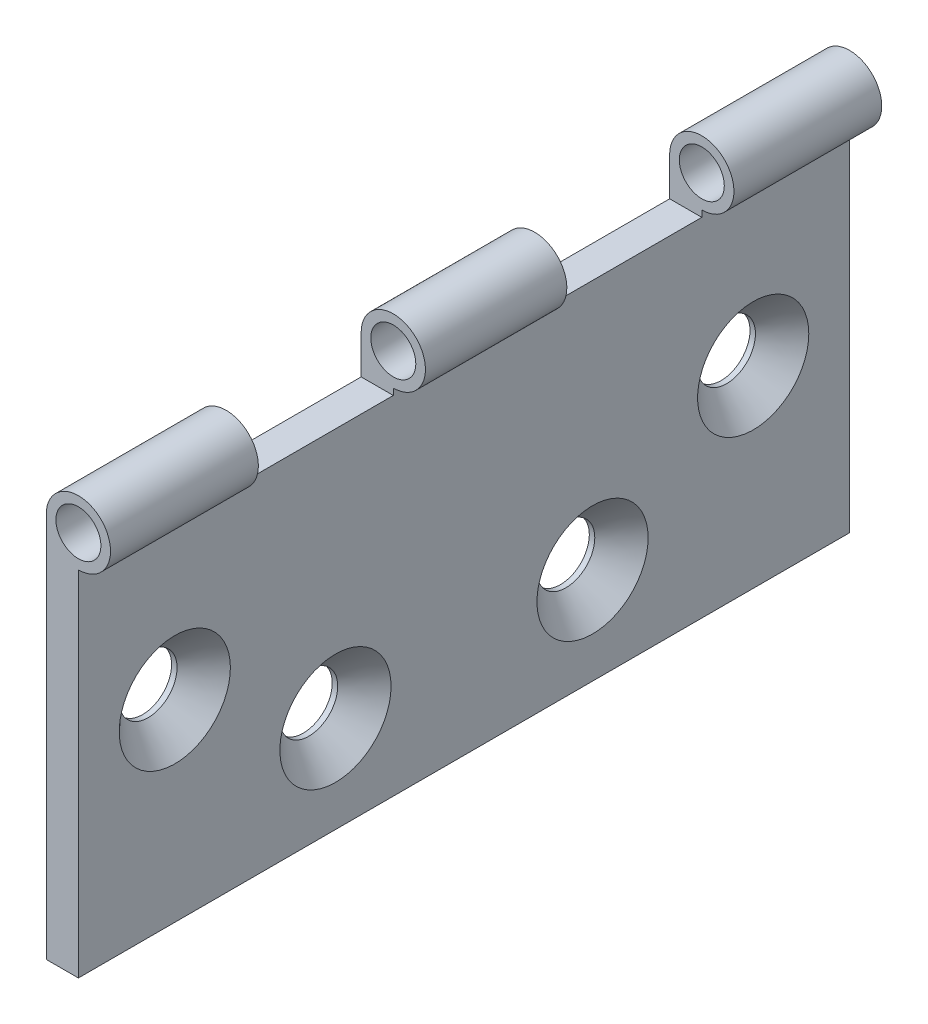
ISO-10303-21;
HEADER;
FILE_DESCRIPTION(('STEP AP214'),'2;1');
FILE_NAME('part.step','',(''),(''),'','','');
FILE_SCHEMA(('AUTOMOTIVE_DESIGN { 1 0 10303 214 1 1 1 1 }'));
ENDSEC;
DATA;
#1=APPLICATION_CONTEXT('core data for automotive mechanical design processes');
#2=APPLICATION_PROTOCOL_DEFINITION('international standard','automotive_design',2000,#1);
#3=PRODUCT_CONTEXT('',#1,'mechanical');
#4=PRODUCT('Part','Part','',(#3));
#5=PRODUCT_RELATED_PRODUCT_CATEGORY('part','',(#4));
#6=PRODUCT_DEFINITION_FORMATION('','',#4);
#7=PRODUCT_DEFINITION_CONTEXT('part definition',#1,'design');
#8=PRODUCT_DEFINITION('design','',#6,#7);
#9=PRODUCT_DEFINITION_SHAPE('','',#8);
#10=(LENGTH_UNIT() NAMED_UNIT(*) SI_UNIT(.MILLI.,.METRE.));
#11=(NAMED_UNIT(*) PLANE_ANGLE_UNIT() SI_UNIT($,.RADIAN.));
#12=(NAMED_UNIT(*) SI_UNIT($,.STERADIAN.) SOLID_ANGLE_UNIT());
#13=UNCERTAINTY_MEASURE_WITH_UNIT(LENGTH_MEASURE(1.E-05),#10,'distance_accuracy_value','');
#14=(GEOMETRIC_REPRESENTATION_CONTEXT(3) GLOBAL_UNCERTAINTY_ASSIGNED_CONTEXT((#13)) GLOBAL_UNIT_ASSIGNED_CONTEXT((#10,
#11,#12)) REPRESENTATION_CONTEXT('',''));
#15=CARTESIAN_POINT('',(0.,0.,0.));
#16=DIRECTION('',(0.,0.,1.));
#17=DIRECTION('',(1.,0.,0.));
#18=AXIS2_PLACEMENT_3D('',#15,#16,#17);
#19=CARTESIAN_POINT('',(5.,60.,60.));
#20=DIRECTION('',(0.,0.,-1.));
#21=DIRECTION('',(-1.,0.,0.));
#22=AXIS2_PLACEMENT_3D('',#19,#20,#21);
#23=CYLINDRICAL_SURFACE('',#22,5.);
#24=DIRECTION('',(0.,0.,-1.));
#25=VECTOR('',#24,1.);
#26=CARTESIAN_POINT('',(5.,55.,60.));
#27=LINE('',#26,#25);
#28=CARTESIAN_POINT('',(5.,55.,60.));
#29=VERTEX_POINT('',#28);
#30=CARTESIAN_POINT('',(5.,55.,37.));
#31=VERTEX_POINT('',#30);
#32=EDGE_CURVE('E95',#29,#31,#27,.T.);
#33=ORIENTED_EDGE('',*,*,#32,.T.);
#34=CARTESIAN_POINT('',(5.,60.,37.));
#35=DIRECTION('',(0.,0.,1.));
#36=DIRECTION('',(1.,0.,0.));
#37=AXIS2_PLACEMENT_3D('',#34,#35,#36);
#38=CIRCLE('',#37,5.);
#39=CARTESIAN_POINT('',(0.,60.,37.));
#40=VERTEX_POINT('',#39);
#41=EDGE_CURVE('E135',#31,#40,#38,.T.);
#42=ORIENTED_EDGE('',*,*,#41,.T.);
#43=DIRECTION('',(0.,0.,-1.));
#44=VECTOR('',#43,1.);
#45=CARTESIAN_POINT('',(0.,60.,60.));
#46=LINE('',#45,#44);
#47=CARTESIAN_POINT('',(0.,60.,60.));
#48=VERTEX_POINT('',#47);
#49=EDGE_CURVE('E11',#48,#40,#46,.T.);
#50=ORIENTED_EDGE('',*,*,#49,.F.);
#51=CARTESIAN_POINT('',(5.,60.,60.));
#52=DIRECTION('',(0.,0.,1.));
#53=DIRECTION('',(1.,0.,0.));
#54=AXIS2_PLACEMENT_3D('',#51,#52,#53);
#55=CIRCLE('',#54,5.);
#56=CARTESIAN_POINT('',(10.,60.,60.));
#57=VERTEX_POINT('',#56);
#58=EDGE_CURVE('E188',#57,#48,#55,.T.);
#59=ORIENTED_EDGE('',*,*,#58,.F.);
#60=EDGE_CURVE('E185',#29,#57,#55,.T.);
#61=ORIENTED_EDGE('',*,*,#60,.F.);
#62=EDGE_LOOP('',(#33,#42,#50,#59,#61));
#63=FACE_BOUND('',#62,.T.);
#64=ADVANCED_FACE('F39',(#63),#23,.T.);
#65=CARTESIAN_POINT('',(0.,60.,11.));
#66=VERTEX_POINT('',#65);
#67=CARTESIAN_POINT('',(0.,60.,-11.));
#68=VERTEX_POINT('',#67);
#69=EDGE_CURVE('E49',#66,#68,#46,.T.);
#70=ORIENTED_EDGE('',*,*,#69,.F.);
#71=CARTESIAN_POINT('',(5.,60.,11.));
#72=DIRECTION('',(0.,0.,-1.));
#73=DIRECTION('',(0.,1.,0.));
#74=AXIS2_PLACEMENT_3D('',#71,#72,#73);
#75=CIRCLE('',#74,5.);
#76=CARTESIAN_POINT('',(5.,55.,11.));
#77=VERTEX_POINT('',#76);
#78=EDGE_CURVE('E115',#66,#77,#75,.T.);
#79=ORIENTED_EDGE('',*,*,#78,.T.);
#80=CARTESIAN_POINT('',(5.,55.,-11.));
#81=VERTEX_POINT('',#80);
#82=EDGE_CURVE('E196',#77,#81,#27,.T.);
#83=ORIENTED_EDGE('',*,*,#82,.T.);
#84=CARTESIAN_POINT('',(5.,60.,-11.));
#85=DIRECTION('',(0.,0.,1.));
#86=DIRECTION('',(0.,-1.,0.));
#87=AXIS2_PLACEMENT_3D('',#84,#85,#86);
#88=CIRCLE('',#87,5.);
#89=EDGE_CURVE('E111',#81,#68,#88,.T.);
#90=ORIENTED_EDGE('',*,*,#89,.T.);
#91=EDGE_LOOP('',(#70,#79,#83,#90));
#92=FACE_BOUND('',#91,.T.);
#93=ADVANCED_FACE('F312',(#92),#23,.T.);
#94=CARTESIAN_POINT('',(5.,60.,-60.));
#95=DIRECTION('',(0.,0.,1.));
#96=DIRECTION('',(1.,0.,0.));
#97=AXIS2_PLACEMENT_3D('',#94,#95,#96);
#98=CYLINDRICAL_SURFACE('',#97,3.5);
#99=CARTESIAN_POINT('',(5.,60.,37.));
#100=DIRECTION('',(0.,0.,1.));
#101=DIRECTION('',(1.,0.,0.));
#102=AXIS2_PLACEMENT_3D('',#99,#100,#101);
#103=CIRCLE('',#102,3.5);
#104=CARTESIAN_POINT('',(8.5,60.,37.));
#105=VERTEX_POINT('',#104);
#106=EDGE_CURVE('E43',#105,#105,#103,.F.);
#107=ORIENTED_EDGE('',*,*,#106,.T.);
#108=EDGE_LOOP('',(#107));
#109=FACE_BOUND('',#108,.T.);
#110=CARTESIAN_POINT('',(5.,60.,60.));
#111=DIRECTION('',(0.,0.,1.));
#112=DIRECTION('',(1.,0.,0.));
#113=AXIS2_PLACEMENT_3D('',#110,#111,#112);
#114=CIRCLE('',#113,3.5);
#115=CARTESIAN_POINT('',(8.5,60.,60.));
#116=VERTEX_POINT('',#115);
#117=EDGE_CURVE('E181',#116,#116,#114,.T.);
#118=ORIENTED_EDGE('',*,*,#117,.T.);
#119=EDGE_LOOP('',(#118));
#120=FACE_BOUND('',#119,.T.);
#121=ADVANCED_FACE('F336',(#109,#120),#98,.F.);
#122=CARTESIAN_POINT('',(5.,0.,60.));
#123=DIRECTION('',(-1.,0.,0.));
#124=DIRECTION('',(0.,0.,1.));
#125=AXIS2_PLACEMENT_3D('',#122,#123,#124);
#126=PLANE('',#125);
#127=CARTESIAN_POINT('',(5.,30.,-45.));
#128=DIRECTION('',(1.,0.,0.));
#129=DIRECTION('',(0.,0.,-1.));
#130=AXIS2_PLACEMENT_3D('',#127,#128,#129);
#131=CIRCLE('',#130,8.65);
#132=CARTESIAN_POINT('',(5.,30.,-53.65));
#133=VERTEX_POINT('',#132);
#134=EDGE_CURVE('E145',#133,#133,#131,.T.);
#135=ORIENTED_EDGE('',*,*,#134,.F.);
#136=EDGE_LOOP('',(#135));
#137=FACE_BOUND('',#136,.T.);
#138=CARTESIAN_POINT('',(5.,15.,-20.));
#139=DIRECTION('',(1.,0.,0.));
#140=DIRECTION('',(0.,0.,-1.));
#141=AXIS2_PLACEMENT_3D('',#138,#139,#140);
#142=CIRCLE('',#141,8.65);
#143=CARTESIAN_POINT('',(5.,15.,-28.65));
#144=VERTEX_POINT('',#143);
#145=EDGE_CURVE('E154',#144,#144,#142,.T.);
#146=ORIENTED_EDGE('',*,*,#145,.F.);
#147=EDGE_LOOP('',(#146));
#148=FACE_BOUND('',#147,.T.);
#149=CARTESIAN_POINT('',(5.,30.,45.));
#150=DIRECTION('',(1.,0.,0.));
#151=DIRECTION('',(0.,0.,-1.));
#152=AXIS2_PLACEMENT_3D('',#149,#150,#151);
#153=CIRCLE('',#152,8.65);
#154=CARTESIAN_POINT('',(5.,30.,36.35));
#155=VERTEX_POINT('',#154);
#156=EDGE_CURVE('E163',#155,#155,#153,.T.);
#157=ORIENTED_EDGE('',*,*,#156,.F.);
#158=EDGE_LOOP('',(#157));
#159=FACE_BOUND('',#158,.T.);
#160=CARTESIAN_POINT('',(5.,15.,20.));
#161=DIRECTION('',(1.,0.,0.));
#162=DIRECTION('',(0.,0.,-1.));
#163=AXIS2_PLACEMENT_3D('',#160,#161,#162);
#164=CIRCLE('',#163,8.65);
#165=CARTESIAN_POINT('',(5.,15.,11.35));
#166=VERTEX_POINT('',#165);
#167=EDGE_CURVE('E172',#166,#166,#164,.T.);
#168=ORIENTED_EDGE('',*,*,#167,.F.);
#169=EDGE_LOOP('',(#168));
#170=FACE_BOUND('',#169,.T.);
#171=DIRECTION('',(0.,0.,1.));
#172=VECTOR('',#171,1.);
#173=CARTESIAN_POINT('',(5.,54.,60.));
#174=LINE('',#173,#172);
#175=CARTESIAN_POINT('',(5.,54.,11.));
#176=VERTEX_POINT('',#175);
#177=CARTESIAN_POINT('',(5.,54.,37.));
#178=VERTEX_POINT('',#177);
#179=EDGE_CURVE('E143',#176,#178,#174,.T.);
#180=ORIENTED_EDGE('',*,*,#179,.T.);
#181=DIRECTION('',(0.,1.,0.));
#182=VECTOR('',#181,1.);
#183=CARTESIAN_POINT('',(5.,0.,37.));
#184=LINE('',#183,#182);
#185=EDGE_CURVE('E138',#178,#31,#184,.T.);
#186=ORIENTED_EDGE('',*,*,#185,.T.);
#187=ORIENTED_EDGE('',*,*,#32,.F.);
#188=DIRECTION('',(0.,1.,0.));
#189=VECTOR('',#188,1.);
#190=CARTESIAN_POINT('',(5.,0.,60.));
#191=LINE('',#190,#189);
#192=CARTESIAN_POINT('',(5.,0.,60.));
#193=VERTEX_POINT('',#192);
#194=EDGE_CURVE('E81',#193,#29,#191,.T.);
#195=ORIENTED_EDGE('',*,*,#194,.F.);
#196=DIRECTION('',(0.,0.,-1.));
#197=VECTOR('',#196,1.);
#198=CARTESIAN_POINT('',(5.,0.,60.));
#199=LINE('',#198,#197);
#200=CARTESIAN_POINT('',(5.,0.,-60.));
#201=VERTEX_POINT('',#200);
#202=EDGE_CURVE('E59',#193,#201,#199,.T.);
#203=ORIENTED_EDGE('',*,*,#202,.T.);
#204=DIRECTION('',(0.,1.,0.));
#205=VECTOR('',#204,1.);
#206=CARTESIAN_POINT('',(5.,0.,-60.));
#207=LINE('',#206,#205);
#208=CARTESIAN_POINT('',(5.,55.,-60.));
#209=VERTEX_POINT('',#208);
#210=EDGE_CURVE('E78',#201,#209,#207,.T.);
#211=ORIENTED_EDGE('',*,*,#210,.T.);
#212=CARTESIAN_POINT('',(5.,55.,-37.));
#213=VERTEX_POINT('',#212);
#214=EDGE_CURVE('E194',#213,#209,#27,.T.);
#215=ORIENTED_EDGE('',*,*,#214,.F.);
#216=DIRECTION('',(0.,-1.,0.));
#217=VECTOR('',#216,1.);
#218=CARTESIAN_POINT('',(5.,0.,-37.));
#219=LINE('',#218,#217);
#220=CARTESIAN_POINT('',(5.,54.,-37.));
#221=VERTEX_POINT('',#220);
#222=EDGE_CURVE('E112',#213,#221,#219,.T.);
#223=ORIENTED_EDGE('',*,*,#222,.T.);
#224=DIRECTION('',(0.,0.,1.));
#225=VECTOR('',#224,1.);
#226=CARTESIAN_POINT('',(5.,54.,60.));
#227=LINE('',#226,#225);
#228=CARTESIAN_POINT('',(5.,54.,-11.));
#229=VERTEX_POINT('',#228);
#230=EDGE_CURVE('E141',#221,#229,#227,.T.);
#231=ORIENTED_EDGE('',*,*,#230,.T.);
#232=DIRECTION('',(0.,1.,0.));
#233=VECTOR('',#232,1.);
#234=CARTESIAN_POINT('',(5.,0.,-11.));
#235=LINE('',#234,#233);
#236=EDGE_CURVE('E116',#229,#81,#235,.T.);
#237=ORIENTED_EDGE('',*,*,#236,.T.);
#238=ORIENTED_EDGE('',*,*,#82,.F.);
#239=DIRECTION('',(0.,-1.,0.));
#240=VECTOR('',#239,1.);
#241=CARTESIAN_POINT('',(5.,0.,11.));
#242=LINE('',#241,#240);
#243=EDGE_CURVE('E120',#77,#176,#242,.T.);
#244=ORIENTED_EDGE('',*,*,#243,.T.);
#245=EDGE_LOOP('',(#180,#186,#187,#195,#203,#211,#215,#223,#231,#237,#238,#244));
#246=FACE_BOUND('',#245,.T.);
#247=ADVANCED_FACE('F41',(#137,#148,#159,#170,#246),#126,.F.);
#248=CARTESIAN_POINT('',(0.,0.,60.));
#249=DIRECTION('',(-1.,0.,0.));
#250=DIRECTION('',(0.,0.,1.));
#251=AXIS2_PLACEMENT_3D('',#248,#249,#250);
#252=PLANE('',#251);
#253=DIRECTION('',(0.,-1.,0.));
#254=VECTOR('',#253,1.);
#255=CARTESIAN_POINT('',(0.,65.,37.));
#256=LINE('',#255,#254);
#257=CARTESIAN_POINT('',(0.,54.,37.));
#258=VERTEX_POINT('',#257);
#259=EDGE_CURVE('E270',#40,#258,#256,.T.);
#260=ORIENTED_EDGE('',*,*,#259,.T.);
#261=DIRECTION('',(0.,0.,-1.));
#262=VECTOR('',#261,1.);
#263=CARTESIAN_POINT('',(0.,54.,37.));
#264=LINE('',#263,#262);
#265=CARTESIAN_POINT('',(0.,54.,11.));
#266=VERTEX_POINT('',#265);
#267=EDGE_CURVE('E275',#258,#266,#264,.T.);
#268=ORIENTED_EDGE('',*,*,#267,.T.);
#269=DIRECTION('',(0.,1.,0.));
#270=VECTOR('',#269,1.);
#271=CARTESIAN_POINT('',(0.,65.,11.));
#272=LINE('',#271,#270);
#273=EDGE_CURVE('E272',#266,#66,#272,.T.);
#274=ORIENTED_EDGE('',*,*,#273,.T.);
#275=ORIENTED_EDGE('',*,*,#69,.T.);
#276=DIRECTION('',(0.,-1.,0.));
#277=VECTOR('',#276,1.);
#278=CARTESIAN_POINT('',(0.,65.,-11.));
#279=LINE('',#278,#277);
#280=CARTESIAN_POINT('',(0.,54.,-11.));
#281=VERTEX_POINT('',#280);
#282=EDGE_CURVE('E295',#68,#281,#279,.T.);
#283=ORIENTED_EDGE('',*,*,#282,.T.);
#284=DIRECTION('',(0.,0.,-1.));
#285=VECTOR('',#284,1.);
#286=CARTESIAN_POINT('',(0.,54.,-11.));
#287=LINE('',#286,#285);
#288=CARTESIAN_POINT('',(0.,54.,-37.));
#289=VERTEX_POINT('',#288);
#290=EDGE_CURVE('E289',#281,#289,#287,.T.);
#291=ORIENTED_EDGE('',*,*,#290,.T.);
#292=DIRECTION('',(0.,1.,0.));
#293=VECTOR('',#292,1.);
#294=CARTESIAN_POINT('',(0.,65.,-37.));
#295=LINE('',#294,#293);
#296=CARTESIAN_POINT('',(0.,60.,-37.));
#297=VERTEX_POINT('',#296);
#298=EDGE_CURVE('E292',#289,#297,#295,.T.);
#299=ORIENTED_EDGE('',*,*,#298,.T.);
#300=CARTESIAN_POINT('',(0.,60.,-60.));
#301=VERTEX_POINT('',#300);
#302=EDGE_CURVE('E51',#297,#301,#46,.T.);
#303=ORIENTED_EDGE('',*,*,#302,.T.);
#304=DIRECTION('',(0.,1.,0.));
#305=VECTOR('',#304,1.);
#306=CARTESIAN_POINT('',(0.,0.,-60.));
#307=LINE('',#306,#305);
#308=CARTESIAN_POINT('',(0.,0.,-60.));
#309=VERTEX_POINT('',#308);
#310=EDGE_CURVE('E94',#309,#301,#307,.T.);
#311=ORIENTED_EDGE('',*,*,#310,.F.);
#312=DIRECTION('',(0.,0.,-1.));
#313=VECTOR('',#312,1.);
#314=CARTESIAN_POINT('',(0.,0.,60.));
#315=LINE('',#314,#313);
#316=CARTESIAN_POINT('',(0.,0.,60.));
#317=VERTEX_POINT('',#316);
#318=EDGE_CURVE('E70',#317,#309,#315,.T.);
#319=ORIENTED_EDGE('',*,*,#318,.F.);
#320=DIRECTION('',(0.,1.,0.));
#321=VECTOR('',#320,1.);
#322=CARTESIAN_POINT('',(0.,0.,60.));
#323=LINE('',#322,#321);
#324=EDGE_CURVE('E99',#317,#48,#323,.T.);
#325=ORIENTED_EDGE('',*,*,#324,.T.);
#326=ORIENTED_EDGE('',*,*,#49,.T.);
#327=EDGE_LOOP('',(#260,#268,#274,#275,#283,#291,#299,#303,#311,#319,#325,#326));
#328=FACE_BOUND('',#327,.T.);
#329=CARTESIAN_POINT('',(0.,30.,-45.));
#330=DIRECTION('',(1.,0.,0.));
#331=DIRECTION('',(0.,0.,-1.));
#332=AXIS2_PLACEMENT_3D('',#329,#330,#331);
#333=CIRCLE('',#332,4.5);
#334=CARTESIAN_POINT('',(0.,30.,-49.5));
#335=VERTEX_POINT('',#334);
#336=EDGE_CURVE('E151',#335,#335,#333,.T.);
#337=ORIENTED_EDGE('',*,*,#336,.T.);
#338=EDGE_LOOP('',(#337));
#339=FACE_BOUND('',#338,.T.);
#340=CARTESIAN_POINT('',(0.,15.,-20.));
#341=DIRECTION('',(1.,0.,0.));
#342=DIRECTION('',(0.,0.,-1.));
#343=AXIS2_PLACEMENT_3D('',#340,#341,#342);
#344=CIRCLE('',#343,4.5);
#345=CARTESIAN_POINT('',(0.,15.,-24.5));
#346=VERTEX_POINT('',#345);
#347=EDGE_CURVE('E160',#346,#346,#344,.T.);
#348=ORIENTED_EDGE('',*,*,#347,.T.);
#349=EDGE_LOOP('',(#348));
#350=FACE_BOUND('',#349,.T.);
#351=CARTESIAN_POINT('',(0.,30.,45.));
#352=DIRECTION('',(1.,0.,0.));
#353=DIRECTION('',(0.,0.,-1.));
#354=AXIS2_PLACEMENT_3D('',#351,#352,#353);
#355=CIRCLE('',#354,4.5);
#356=CARTESIAN_POINT('',(0.,30.,40.5));
#357=VERTEX_POINT('',#356);
#358=EDGE_CURVE('E169',#357,#357,#355,.T.);
#359=ORIENTED_EDGE('',*,*,#358,.T.);
#360=EDGE_LOOP('',(#359));
#361=FACE_BOUND('',#360,.T.);
#362=CARTESIAN_POINT('',(0.,15.,20.));
#363=DIRECTION('',(1.,0.,0.));
#364=DIRECTION('',(0.,0.,-1.));
#365=AXIS2_PLACEMENT_3D('',#362,#363,#364);
#366=CIRCLE('',#365,4.5);
#367=CARTESIAN_POINT('',(0.,15.,15.5));
#368=VERTEX_POINT('',#367);
#369=EDGE_CURVE('E178',#368,#368,#366,.T.);
#370=ORIENTED_EDGE('',*,*,#369,.T.);
#371=EDGE_LOOP('',(#370));
#372=FACE_BOUND('',#371,.T.);
#373=ADVANCED_FACE('F208',(#328,#339,#350,#361,#372),#252,.T.);
#374=CARTESIAN_POINT('',(5.,0.,60.));
#375=DIRECTION('',(0.,-1.,0.));
#376=DIRECTION('',(0.,0.,-1.));
#377=AXIS2_PLACEMENT_3D('',#374,#375,#376);
#378=PLANE('',#377);
#379=DIRECTION('',(-1.,0.,0.));
#380=VECTOR('',#379,1.);
#381=CARTESIAN_POINT('',(5.,0.,-60.));
#382=LINE('',#381,#380);
#383=EDGE_CURVE('E90',#201,#309,#382,.T.);
#384=ORIENTED_EDGE('',*,*,#383,.F.);
#385=ORIENTED_EDGE('',*,*,#202,.F.);
#386=DIRECTION('',(-1.,0.,0.));
#387=VECTOR('',#386,1.);
#388=CARTESIAN_POINT('',(5.,0.,60.));
#389=LINE('',#388,#387);
#390=EDGE_CURVE('E83',#193,#317,#389,.T.);
#391=ORIENTED_EDGE('',*,*,#390,.T.);
#392=ORIENTED_EDGE('',*,*,#318,.T.);
#393=EDGE_LOOP('',(#384,#385,#391,#392));
#394=FACE_BOUND('',#393,.T.);
#395=ADVANCED_FACE('F97',(#394),#378,.T.);
#396=CARTESIAN_POINT('',(0.,0.,60.));
#397=DIRECTION('',(0.,0.,-1.));
#398=DIRECTION('',(-1.,0.,0.));
#399=AXIS2_PLACEMENT_3D('',#396,#397,#398);
#400=PLANE('',#399);
#401=ORIENTED_EDGE('',*,*,#117,.F.);
#402=EDGE_LOOP('',(#401));
#403=FACE_BOUND('',#402,.T.);
#404=ORIENTED_EDGE('',*,*,#194,.T.);
#405=ORIENTED_EDGE('',*,*,#60,.T.);
#406=ORIENTED_EDGE('',*,*,#58,.T.);
#407=ORIENTED_EDGE('',*,*,#324,.F.);
#408=ORIENTED_EDGE('',*,*,#390,.F.);
#409=EDGE_LOOP('',(#404,#405,#406,#407,#408));
#410=FACE_BOUND('',#409,.T.);
#411=ADVANCED_FACE('F202',(#403,#410),#400,.F.);
#412=CARTESIAN_POINT('',(0.,0.,-60.));
#413=DIRECTION('',(0.,0.,-1.));
#414=DIRECTION('',(-1.,0.,0.));
#415=AXIS2_PLACEMENT_3D('',#412,#413,#414);
#416=PLANE('',#415);
#417=CARTESIAN_POINT('',(5.,60.,-60.));
#418=DIRECTION('',(0.,0.,1.));
#419=DIRECTION('',(1.,0.,0.));
#420=AXIS2_PLACEMENT_3D('',#417,#418,#419);
#421=CIRCLE('',#420,3.5);
#422=CARTESIAN_POINT('',(8.5,60.,-60.));
#423=VERTEX_POINT('',#422);
#424=EDGE_CURVE('E182',#423,#423,#421,.T.);
#425=ORIENTED_EDGE('',*,*,#424,.T.);
#426=EDGE_LOOP('',(#425));
#427=FACE_BOUND('',#426,.T.);
#428=ORIENTED_EDGE('',*,*,#310,.T.);
#429=CARTESIAN_POINT('',(5.,60.,-60.));
#430=DIRECTION('',(0.,0.,1.));
#431=DIRECTION('',(1.,0.,0.));
#432=AXIS2_PLACEMENT_3D('',#429,#430,#431);
#433=CIRCLE('',#432,5.);
#434=CARTESIAN_POINT('',(10.,60.,-60.));
#435=VERTEX_POINT('',#434);
#436=EDGE_CURVE('E191',#435,#301,#433,.T.);
#437=ORIENTED_EDGE('',*,*,#436,.F.);
#438=EDGE_CURVE('E93',#209,#435,#433,.T.);
#439=ORIENTED_EDGE('',*,*,#438,.F.);
#440=ORIENTED_EDGE('',*,*,#210,.F.);
#441=ORIENTED_EDGE('',*,*,#383,.T.);
#442=EDGE_LOOP('',(#428,#437,#439,#440,#441));
#443=FACE_BOUND('',#442,.T.);
#444=ADVANCED_FACE('F89',(#427,#443),#416,.T.);
#445=ORIENTED_EDGE('',*,*,#302,.F.);
#446=CARTESIAN_POINT('',(5.,60.,-37.));
#447=DIRECTION('',(0.,0.,-1.));
#448=DIRECTION('',(0.,1.,0.));
#449=AXIS2_PLACEMENT_3D('',#446,#447,#448);
#450=CIRCLE('',#449,5.);
#451=EDGE_CURVE('E107',#297,#213,#450,.T.);
#452=ORIENTED_EDGE('',*,*,#451,.T.);
#453=ORIENTED_EDGE('',*,*,#214,.T.);
#454=ORIENTED_EDGE('',*,*,#438,.T.);
#455=ORIENTED_EDGE('',*,*,#436,.T.);
#456=EDGE_LOOP('',(#445,#452,#453,#454,#455));
#457=FACE_BOUND('',#456,.T.);
#458=ADVANCED_FACE('F307',(#457),#23,.T.);
#459=CARTESIAN_POINT('',(5.,60.,-37.));
#460=DIRECTION('',(0.,0.,-1.));
#461=DIRECTION('',(0.,1.,0.));
#462=AXIS2_PLACEMENT_3D('',#459,#460,#461);
#463=CIRCLE('',#462,3.5);
#464=CARTESIAN_POINT('',(5.,63.5,-37.));
#465=VERTEX_POINT('',#464);
#466=EDGE_CURVE('E104',#465,#465,#463,.F.);
#467=ORIENTED_EDGE('',*,*,#466,.T.);
#468=EDGE_LOOP('',(#467));
#469=FACE_BOUND('',#468,.T.);
#470=ORIENTED_EDGE('',*,*,#424,.F.);
#471=EDGE_LOOP('',(#470));
#472=FACE_BOUND('',#471,.T.);
#473=ADVANCED_FACE('F340',(#469,#472),#98,.F.);
#474=CARTESIAN_POINT('',(5.,15.,20.));
#475=DIRECTION('',(1.,0.,0.));
#476=DIRECTION('',(0.,0.,-1.));
#477=AXIS2_PLACEMENT_3D('',#474,#475,#476);
#478=CYLINDRICAL_SURFACE('',#477,4.5);
#479=ORIENTED_EDGE('',*,*,#369,.F.);
#480=EDGE_LOOP('',(#479));
#481=FACE_BOUND('',#480,.T.);
#482=CARTESIAN_POINT('',(0.849999999999998,15.,20.));
#483=DIRECTION('',(1.,0.,0.));
#484=DIRECTION('',(0.,0.,-1.));
#485=AXIS2_PLACEMENT_3D('',#482,#483,#484);
#486=CIRCLE('',#485,4.5);
#487=CARTESIAN_POINT('',(0.849999999999998,15.,15.5));
#488=VERTEX_POINT('',#487);
#489=EDGE_CURVE('E175',#488,#488,#486,.T.);
#490=ORIENTED_EDGE('',*,*,#489,.T.);
#491=EDGE_LOOP('',(#490));
#492=FACE_BOUND('',#491,.T.);
#493=ADVANCED_FACE('F345',(#481,#492),#478,.F.);
#494=CARTESIAN_POINT('',(5.,15.,20.));
#495=DIRECTION('',(1.,0.,0.));
#496=DIRECTION('',(0.,0.,-1.));
#497=AXIS2_PLACEMENT_3D('',#494,#495,#496);
#498=CONICAL_SURFACE('',#497,8.65,0.785398163397448);
#499=ORIENTED_EDGE('',*,*,#489,.F.);
#500=EDGE_LOOP('',(#499));
#501=FACE_BOUND('',#500,.T.);
#502=ORIENTED_EDGE('',*,*,#167,.T.);
#503=EDGE_LOOP('',(#502));
#504=FACE_BOUND('',#503,.T.);
#505=ADVANCED_FACE('F373',(#501,#504),#498,.F.);
#506=CARTESIAN_POINT('',(5.,30.,45.));
#507=DIRECTION('',(1.,0.,0.));
#508=DIRECTION('',(0.,0.,-1.));
#509=AXIS2_PLACEMENT_3D('',#506,#507,#508);
#510=CYLINDRICAL_SURFACE('',#509,4.5);
#511=ORIENTED_EDGE('',*,*,#358,.F.);
#512=EDGE_LOOP('',(#511));
#513=FACE_BOUND('',#512,.T.);
#514=CARTESIAN_POINT('',(0.849999999999998,30.,45.));
#515=DIRECTION('',(1.,0.,0.));
#516=DIRECTION('',(0.,0.,-1.));
#517=AXIS2_PLACEMENT_3D('',#514,#515,#516);
#518=CIRCLE('',#517,4.5);
#519=CARTESIAN_POINT('',(0.849999999999998,30.,40.5));
#520=VERTEX_POINT('',#519);
#521=EDGE_CURVE('E166',#520,#520,#518,.T.);
#522=ORIENTED_EDGE('',*,*,#521,.T.);
#523=EDGE_LOOP('',(#522));
#524=FACE_BOUND('',#523,.T.);
#525=ADVANCED_FACE('F375',(#513,#524),#510,.F.);
#526=CARTESIAN_POINT('',(5.,30.,45.));
#527=DIRECTION('',(1.,0.,0.));
#528=DIRECTION('',(0.,0.,-1.));
#529=AXIS2_PLACEMENT_3D('',#526,#527,#528);
#530=CONICAL_SURFACE('',#529,8.65,0.785398163397447);
#531=ORIENTED_EDGE('',*,*,#521,.F.);
#532=EDGE_LOOP('',(#531));
#533=FACE_BOUND('',#532,.T.);
#534=ORIENTED_EDGE('',*,*,#156,.T.);
#535=EDGE_LOOP('',(#534));
#536=FACE_BOUND('',#535,.T.);
#537=ADVANCED_FACE('F382',(#533,#536),#530,.F.);
#538=CARTESIAN_POINT('',(5.,15.,-20.));
#539=DIRECTION('',(1.,0.,0.));
#540=DIRECTION('',(0.,0.,-1.));
#541=AXIS2_PLACEMENT_3D('',#538,#539,#540);
#542=CYLINDRICAL_SURFACE('',#541,4.5);
#543=ORIENTED_EDGE('',*,*,#347,.F.);
#544=EDGE_LOOP('',(#543));
#545=FACE_BOUND('',#544,.T.);
#546=CARTESIAN_POINT('',(0.849999999999998,15.,-20.));
#547=DIRECTION('',(1.,0.,0.));
#548=DIRECTION('',(0.,0.,-1.));
#549=AXIS2_PLACEMENT_3D('',#546,#547,#548);
#550=CIRCLE('',#549,4.5);
#551=CARTESIAN_POINT('',(0.849999999999998,15.,-24.5));
#552=VERTEX_POINT('',#551);
#553=EDGE_CURVE('E157',#552,#552,#550,.T.);
#554=ORIENTED_EDGE('',*,*,#553,.T.);
#555=EDGE_LOOP('',(#554));
#556=FACE_BOUND('',#555,.T.);
#557=ADVANCED_FACE('F391',(#545,#556),#542,.F.);
#558=CARTESIAN_POINT('',(5.,15.,-20.));
#559=DIRECTION('',(1.,0.,0.));
#560=DIRECTION('',(0.,0.,-1.));
#561=AXIS2_PLACEMENT_3D('',#558,#559,#560);
#562=CONICAL_SURFACE('',#561,8.65,0.785398163397448);
#563=ORIENTED_EDGE('',*,*,#553,.F.);
#564=EDGE_LOOP('',(#563));
#565=FACE_BOUND('',#564,.T.);
#566=ORIENTED_EDGE('',*,*,#145,.T.);
#567=EDGE_LOOP('',(#566));
#568=FACE_BOUND('',#567,.T.);
#569=ADVANCED_FACE('F395',(#565,#568),#562,.F.);
#570=CARTESIAN_POINT('',(5.,30.,-45.));
#571=DIRECTION('',(1.,0.,0.));
#572=DIRECTION('',(0.,0.,-1.));
#573=AXIS2_PLACEMENT_3D('',#570,#571,#572);
#574=CYLINDRICAL_SURFACE('',#573,4.5);
#575=ORIENTED_EDGE('',*,*,#336,.F.);
#576=EDGE_LOOP('',(#575));
#577=FACE_BOUND('',#576,.T.);
#578=CARTESIAN_POINT('',(0.849999999999998,30.,-45.));
#579=DIRECTION('',(1.,0.,0.));
#580=DIRECTION('',(0.,0.,-1.));
#581=AXIS2_PLACEMENT_3D('',#578,#579,#580);
#582=CIRCLE('',#581,4.5);
#583=CARTESIAN_POINT('',(0.849999999999998,30.,-49.5));
#584=VERTEX_POINT('',#583);
#585=EDGE_CURVE('E148',#584,#584,#582,.T.);
#586=ORIENTED_EDGE('',*,*,#585,.T.);
#587=EDGE_LOOP('',(#586));
#588=FACE_BOUND('',#587,.T.);
#589=ADVANCED_FACE('F327',(#577,#588),#574,.F.);
#590=CARTESIAN_POINT('',(5.,30.,-45.));
#591=DIRECTION('',(1.,0.,0.));
#592=DIRECTION('',(0.,0.,-1.));
#593=AXIS2_PLACEMENT_3D('',#590,#591,#592);
#594=CONICAL_SURFACE('',#593,8.65,0.785398163397447);
#595=ORIENTED_EDGE('',*,*,#585,.F.);
#596=EDGE_LOOP('',(#595));
#597=FACE_BOUND('',#596,.T.);
#598=ORIENTED_EDGE('',*,*,#134,.T.);
#599=EDGE_LOOP('',(#598));
#600=FACE_BOUND('',#599,.T.);
#601=ADVANCED_FACE('F319',(#597,#600),#594,.F.);
#602=CARTESIAN_POINT('',(0.,54.,-11.));
#603=DIRECTION('',(0.,-1.,0.));
#604=DIRECTION('',(0.,0.,-1.));
#605=AXIS2_PLACEMENT_3D('',#602,#603,#604);
#606=PLANE('',#605);
#607=DIRECTION('',(1.,0.,0.));
#608=VECTOR('',#607,1.);
#609=CARTESIAN_POINT('',(0.,54.,-37.));
#610=LINE('',#609,#608);
#611=EDGE_CURVE('E284',#289,#221,#610,.T.);
#612=ORIENTED_EDGE('',*,*,#611,.F.);
#613=ORIENTED_EDGE('',*,*,#290,.F.);
#614=DIRECTION('',(1.,0.,0.));
#615=VECTOR('',#614,1.);
#616=CARTESIAN_POINT('',(0.,54.,-11.));
#617=LINE('',#616,#615);
#618=EDGE_CURVE('E281',#281,#229,#617,.T.);
#619=ORIENTED_EDGE('',*,*,#618,.T.);
#620=ORIENTED_EDGE('',*,*,#230,.F.);
#621=EDGE_LOOP('',(#612,#613,#619,#620));
#622=FACE_BOUND('',#621,.T.);
#623=ADVANCED_FACE('F317',(#622),#606,.F.);
#624=CARTESIAN_POINT('',(0.,65.,-11.));
#625=DIRECTION('',(0.,0.,1.));
#626=DIRECTION('',(0.,-1.,0.));
#627=AXIS2_PLACEMENT_3D('',#624,#625,#626);
#628=PLANE('',#627);
#629=CARTESIAN_POINT('',(5.,60.,-11.));
#630=DIRECTION('',(0.,0.,1.));
#631=DIRECTION('',(0.,-1.,0.));
#632=AXIS2_PLACEMENT_3D('',#629,#630,#631);
#633=CIRCLE('',#632,3.5);
#634=CARTESIAN_POINT('',(5.,56.5,-11.));
#635=VERTEX_POINT('',#634);
#636=EDGE_CURVE('E109',#635,#635,#633,.F.);
#637=ORIENTED_EDGE('',*,*,#636,.F.);
#638=EDGE_LOOP('',(#637));
#639=FACE_BOUND('',#638,.T.);
#640=ORIENTED_EDGE('',*,*,#89,.F.);
#641=ORIENTED_EDGE('',*,*,#236,.F.);
#642=ORIENTED_EDGE('',*,*,#618,.F.);
#643=ORIENTED_EDGE('',*,*,#282,.F.);
#644=EDGE_LOOP('',(#640,#641,#642,#643));
#645=FACE_BOUND('',#644,.T.);
#646=ADVANCED_FACE('F314',(#639,#645),#628,.F.);
#647=CARTESIAN_POINT('',(0.,65.,-37.));
#648=DIRECTION('',(0.,0.,-1.));
#649=DIRECTION('',(0.,1.,0.));
#650=AXIS2_PLACEMENT_3D('',#647,#648,#649);
#651=PLANE('',#650);
#652=ORIENTED_EDGE('',*,*,#466,.F.);
#653=EDGE_LOOP('',(#652));
#654=FACE_BOUND('',#653,.T.);
#655=ORIENTED_EDGE('',*,*,#451,.F.);
#656=ORIENTED_EDGE('',*,*,#298,.F.);
#657=ORIENTED_EDGE('',*,*,#611,.T.);
#658=ORIENTED_EDGE('',*,*,#222,.F.);
#659=EDGE_LOOP('',(#655,#656,#657,#658));
#660=FACE_BOUND('',#659,.T.);
#661=ADVANCED_FACE('F303',(#654,#660),#651,.F.);
#662=CARTESIAN_POINT('',(5.,60.,11.));
#663=DIRECTION('',(0.,0.,-1.));
#664=DIRECTION('',(0.,1.,0.));
#665=AXIS2_PLACEMENT_3D('',#662,#663,#664);
#666=CIRCLE('',#665,3.5);
#667=CARTESIAN_POINT('',(5.,63.5,11.));
#668=VERTEX_POINT('',#667);
#669=EDGE_CURVE('E113',#668,#668,#666,.F.);
#670=ORIENTED_EDGE('',*,*,#669,.T.);
#671=EDGE_LOOP('',(#670));
#672=FACE_BOUND('',#671,.T.);
#673=ORIENTED_EDGE('',*,*,#636,.T.);
#674=EDGE_LOOP('',(#673));
#675=FACE_BOUND('',#674,.T.);
#676=ADVANCED_FACE('F347',(#672,#675),#98,.F.);
#677=CARTESIAN_POINT('',(0.,54.,37.));
#678=DIRECTION('',(0.,-1.,0.));
#679=DIRECTION('',(0.,0.,-1.));
#680=AXIS2_PLACEMENT_3D('',#677,#678,#679);
#681=PLANE('',#680);
#682=DIRECTION('',(1.,0.,0.));
#683=VECTOR('',#682,1.);
#684=CARTESIAN_POINT('',(0.,54.,11.));
#685=LINE('',#684,#683);
#686=EDGE_CURVE('E108',#266,#176,#685,.T.);
#687=ORIENTED_EDGE('',*,*,#686,.F.);
#688=ORIENTED_EDGE('',*,*,#267,.F.);
#689=DIRECTION('',(1.,0.,0.));
#690=VECTOR('',#689,1.);
#691=CARTESIAN_POINT('',(0.,54.,37.));
#692=LINE('',#691,#690);
#693=EDGE_CURVE('E267',#258,#178,#692,.T.);
#694=ORIENTED_EDGE('',*,*,#693,.T.);
#695=ORIENTED_EDGE('',*,*,#179,.F.);
#696=EDGE_LOOP('',(#687,#688,#694,#695));
#697=FACE_BOUND('',#696,.T.);
#698=ADVANCED_FACE('F276',(#697),#681,.F.);
#699=CARTESIAN_POINT('',(0.,65.,37.));
#700=DIRECTION('',(0.,0.,1.));
#701=DIRECTION('',(1.,0.,0.));
#702=AXIS2_PLACEMENT_3D('',#699,#700,#701);
#703=PLANE('',#702);
#704=ORIENTED_EDGE('',*,*,#106,.F.);
#705=EDGE_LOOP('',(#704));
#706=FACE_BOUND('',#705,.T.);
#707=ORIENTED_EDGE('',*,*,#41,.F.);
#708=ORIENTED_EDGE('',*,*,#185,.F.);
#709=ORIENTED_EDGE('',*,*,#693,.F.);
#710=ORIENTED_EDGE('',*,*,#259,.F.);
#711=EDGE_LOOP('',(#707,#708,#709,#710));
#712=FACE_BOUND('',#711,.T.);
#713=ADVANCED_FACE('F269',(#706,#712),#703,.F.);
#714=CARTESIAN_POINT('',(0.,65.,11.));
#715=DIRECTION('',(0.,0.,-1.));
#716=DIRECTION('',(0.,1.,0.));
#717=AXIS2_PLACEMENT_3D('',#714,#715,#716);
#718=PLANE('',#717);
#719=ORIENTED_EDGE('',*,*,#669,.F.);
#720=EDGE_LOOP('',(#719));
#721=FACE_BOUND('',#720,.T.);
#722=ORIENTED_EDGE('',*,*,#78,.F.);
#723=ORIENTED_EDGE('',*,*,#273,.F.);
#724=ORIENTED_EDGE('',*,*,#686,.T.);
#725=ORIENTED_EDGE('',*,*,#243,.F.);
#726=EDGE_LOOP('',(#722,#723,#724,#725));
#727=FACE_BOUND('',#726,.T.);
#728=ADVANCED_FACE('F508',(#721,#727),#718,.F.);
#729=CLOSED_SHELL('',(#64,#93,#121,#247,#373,#395,#411,#444,#458,#473,#493,#505,#525,#537,#557,
#569,#589,#601,#623,#646,#661,#676,#698,#713,#728));
#730=MANIFOLD_SOLID_BREP('B2',#729);
#731=ADVANCED_BREP_SHAPE_REPRESENTATION('',(#18,#730),#14);
#732=SHAPE_DEFINITION_REPRESENTATION(#9,#731);
ENDSEC;
END-ISO-10303-21;
